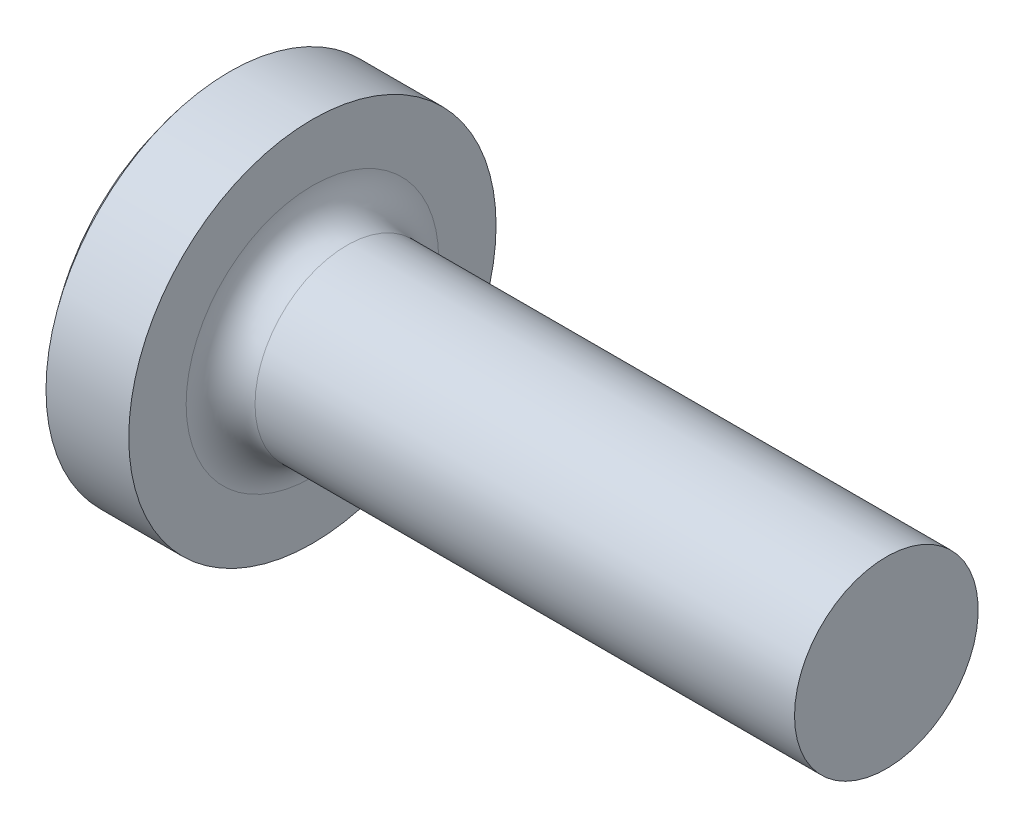
ISO-10303-21;
HEADER;
FILE_DESCRIPTION(('STEP AP214'),'2;1');
FILE_NAME('part.step','',(''),(''),'','','');
FILE_SCHEMA(('AUTOMOTIVE_DESIGN { 1 0 10303 214 1 1 1 1 }'));
ENDSEC;
DATA;
#1=APPLICATION_CONTEXT('core data for automotive mechanical design processes');
#2=APPLICATION_PROTOCOL_DEFINITION('international standard','automotive_design',2000,#1);
#3=PRODUCT_CONTEXT('',#1,'mechanical');
#4=PRODUCT('Part','Part','',(#3));
#5=PRODUCT_RELATED_PRODUCT_CATEGORY('part','',(#4));
#6=PRODUCT_DEFINITION_FORMATION('','',#4);
#7=PRODUCT_DEFINITION_CONTEXT('part definition',#1,'design');
#8=PRODUCT_DEFINITION('design','',#6,#7);
#9=PRODUCT_DEFINITION_SHAPE('','',#8);
#10=(LENGTH_UNIT() NAMED_UNIT(*) SI_UNIT(.MILLI.,.METRE.));
#11=(NAMED_UNIT(*) PLANE_ANGLE_UNIT() SI_UNIT($,.RADIAN.));
#12=(NAMED_UNIT(*) SI_UNIT($,.STERADIAN.) SOLID_ANGLE_UNIT());
#13=UNCERTAINTY_MEASURE_WITH_UNIT(LENGTH_MEASURE(1.E-05),#10,'distance_accuracy_value','');
#14=(GEOMETRIC_REPRESENTATION_CONTEXT(3) GLOBAL_UNCERTAINTY_ASSIGNED_CONTEXT((#13)) GLOBAL_UNIT_ASSIGNED_CONTEXT((#10,
#11,#12)) REPRESENTATION_CONTEXT('',''));
#15=CARTESIAN_POINT('',(0.,0.,0.));
#16=DIRECTION('',(0.,0.,1.));
#17=DIRECTION('',(1.,0.,0.));
#18=AXIS2_PLACEMENT_3D('',#15,#16,#17);
#19=CARTESIAN_POINT('',(0.9,-0.351276568235157,0.176));
#20=DIRECTION('',(1.,0.,0.));
#21=DIRECTION('',(0.,0.,-1.));
#22=AXIS2_PLACEMENT_3D('',#19,#20,#21);
#23=PLANE('',#22);
#24=DIRECTION('',(0.,0.,-1.));
#25=VECTOR('',#24,1.);
#26=CARTESIAN_POINT('',(0.9,0.175999999999998,0.351276568235158));
#27=LINE('',#26,#25);
#28=CARTESIAN_POINT('',(0.9,0.176000000000001,-0.351276568235157));
#29=VERTEX_POINT('',#28);
#30=CARTESIAN_POINT('',(0.900000000000567,0.176000000000056,-0.272346018814301));
#31=VERTEX_POINT('',#30);
#32=EDGE_CURVE('E313',#29,#31,#27,.F.);
#33=ORIENTED_EDGE('',*,*,#32,.F.);
#34=DIRECTION('',(0.,1.,0.));
#35=VECTOR('',#34,1.);
#36=CARTESIAN_POINT('',(0.899999999999999,0.176000000000001,-0.351276568235157));
#37=LINE('',#36,#35);
#38=CARTESIAN_POINT('',(0.9,-0.175999999999998,-0.351276568235158));
#39=VERTEX_POINT('',#38);
#40=EDGE_CURVE('E319',#39,#29,#37,.T.);
#41=ORIENTED_EDGE('',*,*,#40,.F.);
#42=DIRECTION('',(0.,0.,1.));
#43=VECTOR('',#42,1.);
#44=CARTESIAN_POINT('',(0.9,-0.175999999999999,-0.351276568235158));
#45=LINE('',#44,#43);
#46=CARTESIAN_POINT('',(0.900000000000567,-0.176000000000054,-0.272346018814302));
#47=VERTEX_POINT('',#46);
#48=EDGE_CURVE('E320',#47,#39,#45,.F.);
#49=ORIENTED_EDGE('',*,*,#48,.F.);
#50=CARTESIAN_POINT('',(0.899999999999679,0.,0.));
#51=DIRECTION('',(-1.,0.,0.));
#52=DIRECTION('',(0.,-1.,0.));
#53=AXIS2_PLACEMENT_3D('',#50,#51,#52);
#54=CIRCLE('',#53,0.32426586925105);
#55=EDGE_CURVE('E504',#47,#31,#54,.F.);
#56=ORIENTED_EDGE('',*,*,#55,.T.);
#57=EDGE_LOOP('',(#33,#41,#49,#56));
#58=FACE_BOUND('',#57,.T.);
#59=ADVANCED_FACE('F16',(#58),#23,.F.);
#60=CARTESIAN_POINT('',(0.9,-0.351276568235157,0.176));
#61=DIRECTION('',(1.,0.,0.));
#62=DIRECTION('',(0.,0.,-1.));
#63=AXIS2_PLACEMENT_3D('',#60,#61,#62);
#64=PLANE('',#63);
#65=DIRECTION('',(0.,1.,0.));
#66=VECTOR('',#65,1.);
#67=CARTESIAN_POINT('',(0.9,-0.351276568235157,0.176));
#68=LINE('',#67,#66);
#69=CARTESIAN_POINT('',(0.9,0.351276568235157,0.176));
#70=VERTEX_POINT('',#69);
#71=CARTESIAN_POINT('',(0.900000000000567,0.272346018814301,0.176000000000056));
#72=VERTEX_POINT('',#71);
#73=EDGE_CURVE('E146',#70,#72,#68,.F.);
#74=ORIENTED_EDGE('',*,*,#73,.F.);
#75=DIRECTION('',(0.,0.,1.));
#76=VECTOR('',#75,1.);
#77=CARTESIAN_POINT('',(0.9,0.351276568235157,0.176));
#78=LINE('',#77,#76);
#79=CARTESIAN_POINT('',(0.9,0.351276568235157,-0.176));
#80=VERTEX_POINT('',#79);
#81=EDGE_CURVE('E164',#80,#70,#78,.T.);
#82=ORIENTED_EDGE('',*,*,#81,.F.);
#83=DIRECTION('',(0.,1.,0.));
#84=VECTOR('',#83,1.);
#85=CARTESIAN_POINT('',(0.9,0.351276568235157,-0.176));
#86=LINE('',#85,#84);
#87=CARTESIAN_POINT('',(0.900000000000567,0.272346018814302,-0.176000000000055));
#88=VERTEX_POINT('',#87);
#89=EDGE_CURVE('E148',#88,#80,#86,.T.);
#90=ORIENTED_EDGE('',*,*,#89,.F.);
#91=CARTESIAN_POINT('',(0.899999999999679,0.,0.));
#92=DIRECTION('',(-1.,0.,0.));
#93=DIRECTION('',(0.,-1.,0.));
#94=AXIS2_PLACEMENT_3D('',#91,#92,#93);
#95=CIRCLE('',#94,0.32426586925105);
#96=EDGE_CURVE('E142',#88,#72,#95,.F.);
#97=ORIENTED_EDGE('',*,*,#96,.T.);
#98=EDGE_LOOP('',(#74,#82,#90,#97));
#99=FACE_BOUND('',#98,.T.);
#100=ADVANCED_FACE('F144',(#99),#64,.F.);
#101=CARTESIAN_POINT('',(0.9,-0.351276568235157,0.176));
#102=DIRECTION('',(1.,0.,0.));
#103=DIRECTION('',(0.,0.,-1.));
#104=AXIS2_PLACEMENT_3D('',#101,#102,#103);
#105=PLANE('',#104);
#106=DIRECTION('',(0.,0.,1.));
#107=VECTOR('',#106,1.);
#108=CARTESIAN_POINT('',(0.9,-0.175999999999999,-0.351276568235158));
#109=LINE('',#108,#107);
#110=CARTESIAN_POINT('',(0.9,-0.176000000000001,0.351276568235156));
#111=VERTEX_POINT('',#110);
#112=CARTESIAN_POINT('',(0.900000000000567,-0.176000000000056,0.272346018814301));
#113=VERTEX_POINT('',#112);
#114=EDGE_CURVE('E276',#111,#113,#109,.F.);
#115=ORIENTED_EDGE('',*,*,#114,.F.);
#116=DIRECTION('',(0.,1.,0.));
#117=VECTOR('',#116,1.);
#118=CARTESIAN_POINT('',(0.9,-0.176000000000001,0.351276568235157));
#119=LINE('',#118,#117);
#120=CARTESIAN_POINT('',(0.9,0.175999999999998,0.351276568235158));
#121=VERTEX_POINT('',#120);
#122=EDGE_CURVE('E282',#121,#111,#119,.F.);
#123=ORIENTED_EDGE('',*,*,#122,.F.);
#124=DIRECTION('',(0.,0.,-1.));
#125=VECTOR('',#124,1.);
#126=CARTESIAN_POINT('',(0.9,0.175999999999998,0.351276568235158));
#127=LINE('',#126,#125);
#128=CARTESIAN_POINT('',(0.900000000000567,0.176000000000031,0.272346018814317));
#129=VERTEX_POINT('',#128);
#130=EDGE_CURVE('E283',#129,#121,#127,.F.);
#131=ORIENTED_EDGE('',*,*,#130,.F.);
#132=CARTESIAN_POINT('',(0.899999999999679,0.,0.));
#133=DIRECTION('',(-1.,0.,0.));
#134=DIRECTION('',(0.,-1.,0.));
#135=AXIS2_PLACEMENT_3D('',#132,#133,#134);
#136=CIRCLE('',#135,0.32426586925105);
#137=EDGE_CURVE('E154',#129,#113,#136,.F.);
#138=ORIENTED_EDGE('',*,*,#137,.T.);
#139=EDGE_LOOP('',(#115,#123,#131,#138));
#140=FACE_BOUND('',#139,.T.);
#141=ADVANCED_FACE('F710',(#140),#105,.F.);
#142=CARTESIAN_POINT('',(0.899999999999679,0.,0.));
#143=DIRECTION('',(-1.,0.,0.));
#144=DIRECTION('',(0.,-1.,0.));
#145=AXIS2_PLACEMENT_3D('',#142,#143,#144);
#146=CONICAL_SURFACE('',#145,0.32426586925105,1.25663706143554);
#147=CARTESIAN_POINT('',(1.00536036773552,0.,0.));
#148=VERTEX_POINT('',#147);
#149=VERTEX_LOOP('',#148);
#150=FACE_BOUND('',#149,.T.);
#151=CARTESIAN_POINT('',(0.900000000001455,0.,0.));
#152=DIRECTION('',(-1.,0.,0.));
#153=DIRECTION('',(0.,0.,1.));
#154=AXIS2_PLACEMENT_3D('',#151,#152,#153);
#155=CIRCLE('',#154,0.324265869259932);
#156=EDGE_CURVE('E312',#88,#31,#155,.T.);
#157=ORIENTED_EDGE('',*,*,#156,.T.);
#158=ORIENTED_EDGE('',*,*,#55,.F.);
#159=CARTESIAN_POINT('',(0.900000000001455,0.,0.));
#160=DIRECTION('',(-1.,0.,0.));
#161=DIRECTION('',(0.,0.,1.));
#162=AXIS2_PLACEMENT_3D('',#159,#160,#161);
#163=CIRCLE('',#162,0.324265869259932);
#164=CARTESIAN_POINT('',(0.900000000000567,-0.272346018814301,-0.176000000000055));
#165=VERTEX_POINT('',#164);
#166=EDGE_CURVE('E373',#47,#165,#163,.T.);
#167=ORIENTED_EDGE('',*,*,#166,.T.);
#168=CARTESIAN_POINT('',(0.899999999999679,0.,0.));
#169=DIRECTION('',(-1.,0.,0.));
#170=DIRECTION('',(0.,-1.,0.));
#171=AXIS2_PLACEMENT_3D('',#168,#169,#170);
#172=CIRCLE('',#171,0.32426586925105);
#173=CARTESIAN_POINT('',(0.900000000000567,-0.272346018814301,0.176000000000056));
#174=VERTEX_POINT('',#173);
#175=EDGE_CURVE('E327',#165,#174,#172,.T.);
#176=ORIENTED_EDGE('',*,*,#175,.T.);
#177=CARTESIAN_POINT('',(0.900000000001455,0.,0.));
#178=DIRECTION('',(-1.,0.,0.));
#179=DIRECTION('',(0.,0.,1.));
#180=AXIS2_PLACEMENT_3D('',#177,#178,#179);
#181=CIRCLE('',#180,0.324265869259932);
#182=EDGE_CURVE('E275',#174,#113,#181,.T.);
#183=ORIENTED_EDGE('',*,*,#182,.T.);
#184=ORIENTED_EDGE('',*,*,#137,.F.);
#185=CARTESIAN_POINT('',(0.900000000001455,0.,0.));
#186=DIRECTION('',(-1.,0.,0.));
#187=DIRECTION('',(0.,0.,1.));
#188=AXIS2_PLACEMENT_3D('',#185,#186,#187);
#189=CIRCLE('',#188,0.324265869259932);
#190=EDGE_CURVE('E167',#129,#72,#189,.T.);
#191=ORIENTED_EDGE('',*,*,#190,.T.);
#192=ORIENTED_EDGE('',*,*,#96,.F.);
#193=EDGE_LOOP('',(#157,#158,#167,#176,#183,#184,#191,#192));
#194=FACE_BOUND('',#193,.T.);
#195=ADVANCED_FACE('F168',(#150,#194),#146,.F.);
#196=CARTESIAN_POINT('',(0.9,-0.351276568235157,0.176));
#197=DIRECTION('',(1.,0.,0.));
#198=DIRECTION('',(0.,0.,-1.));
#199=AXIS2_PLACEMENT_3D('',#196,#197,#198);
#200=PLANE('',#199);
#201=DIRECTION('',(0.,1.,0.));
#202=VECTOR('',#201,1.);
#203=CARTESIAN_POINT('',(0.9,0.351276568235157,-0.176));
#204=LINE('',#203,#202);
#205=CARTESIAN_POINT('',(0.9,-0.351276568235158,-0.176));
#206=VERTEX_POINT('',#205);
#207=EDGE_CURVE('E323',#206,#165,#204,.T.);
#208=ORIENTED_EDGE('',*,*,#207,.F.);
#209=DIRECTION('',(0.,0.,1.));
#210=VECTOR('',#209,1.);
#211=CARTESIAN_POINT('',(0.9,-0.351276568235158,-0.176));
#212=LINE('',#211,#210);
#213=CARTESIAN_POINT('',(0.9,-0.351276568235158,0.176));
#214=VERTEX_POINT('',#213);
#215=EDGE_CURVE('E263',#214,#206,#212,.F.);
#216=ORIENTED_EDGE('',*,*,#215,.F.);
#217=DIRECTION('',(0.,1.,0.));
#218=VECTOR('',#217,1.);
#219=CARTESIAN_POINT('',(0.9,-0.351276568235157,0.176));
#220=LINE('',#219,#218);
#221=EDGE_CURVE('E269',#174,#214,#220,.F.);
#222=ORIENTED_EDGE('',*,*,#221,.F.);
#223=ORIENTED_EDGE('',*,*,#175,.F.);
#224=EDGE_LOOP('',(#208,#216,#222,#223));
#225=FACE_BOUND('',#224,.T.);
#226=ADVANCED_FACE('F695',(#225),#200,.F.);
#227=CARTESIAN_POINT('',(0.9,0.351276568235157,-0.176));
#228=DIRECTION('',(0.,0.,1.));
#229=DIRECTION('',(1.,0.,0.));
#230=AXIS2_PLACEMENT_3D('',#227,#228,#229);
#231=PLANE('',#230);
#232=CARTESIAN_POINT('',(0.118768628304798,-0.740784148355366,-0.176));
#233=CARTESIAN_POINT('',(0.0985079804228012,-0.675625375165541,-0.176000000000001));
#234=CARTESIAN_POINT('',(0.0809669832444764,-0.609859297006919,-0.176000000000002));
#235=CARTESIAN_POINT('',(0.051324290295171,-0.47711253075208,-0.175999999999999));
#236=CARTESIAN_POINT('',(0.0392225945241903,-0.410131842655864,-0.175999999999996));
#237=CARTESIAN_POINT('',(0.0298405494568816,-0.342543849590851,-0.175999999999992));
#238=B_SPLINE_CURVE_WITH_KNOTS('',3,(#232,#233,#234,#235,#236,#237),.UNSPECIFIED.,.F.,.F.,(4,2,
4),(0.,0.20419542738608,0.40839085477216),.UNSPECIFIED.);
#239=CARTESIAN_POINT('',(0.118768628304983,-0.740784148355962,-0.176));
#240=VERTEX_POINT('',#239);
#241=CARTESIAN_POINT('',(0.0298405494691908,-0.342543849594728,-0.176));
#242=VERTEX_POINT('',#241);
#243=EDGE_CURVE('E244',#240,#242,#238,.T.);
#244=ORIENTED_EDGE('',*,*,#243,.F.);
#245=DIRECTION('',(-0.89493436774996,-0.446197800778958,0.));
#246=VECTOR('',#245,1.);
#247=CARTESIAN_POINT('',(0.9,-0.351276568235157,-0.176));
#248=LINE('',#247,#246);
#249=EDGE_CURVE('E245',#206,#240,#248,.T.);
#250=ORIENTED_EDGE('',*,*,#249,.F.);
#251=ORIENTED_EDGE('',*,*,#207,.T.);
#252=CARTESIAN_POINT('',(0.90000000000064,-0.272346018812238,-0.176));
#253=CARTESIAN_POINT('',(0.799307331680196,-0.280725979726032,-0.176));
#254=CARTESIAN_POINT('',(0.698605885550756,-0.288999402443913,-0.176));
#255=CARTESIAN_POINT('',(0.497188868387912,-0.305370527903754,-0.176));
#256=CARTESIAN_POINT('',(0.396473297378266,-0.313468230937793,-0.176));
#257=CARTESIAN_POINT('',(0.207118890751843,-0.328561778478797,-0.176));
#258=CARTESIAN_POINT('',(0.118481299322804,-0.335573228772296,-0.176));
#259=CARTESIAN_POINT('',(0.0298405494651892,-0.342543849595043,-0.176));
#260=B_SPLINE_CURVE_WITH_KNOTS('',3,(#252,#253,#254,#255,#256,#257,#258,#259),.UNSPECIFIED.,.F.,
.F.,(4,2,2,4),(0.,0.3031221189748,0.606243734063046,0.872987041262529),.UNSPECIFIED.);
#261=EDGE_CURVE('E326',#165,#242,#260,.T.);
#262=ORIENTED_EDGE('',*,*,#261,.T.);
#263=EDGE_LOOP('',(#244,#250,#251,#262));
#264=FACE_BOUND('',#263,.T.);
#265=ADVANCED_FACE('F489',(#264),#231,.T.);
#266=CARTESIAN_POINT('',(0.0298405495868792,0.,0.));
#267=DIRECTION('',(-1.,0.,0.));
#268=DIRECTION('',(0.,-1.,0.));
#269=AXIS2_PLACEMENT_3D('',#266,#267,#268);
#270=CONICAL_SURFACE('',#269,0.385113345508614,0.0698131700854167);
#271=CARTESIAN_POINT('',(0.0298405494597493,-0.175999999999999,-0.342543849595471));
#272=CARTESIAN_POINT('',(0.149471630685286,-0.175999999999999,-0.333133981029725));
#273=CARTESIAN_POINT('',(0.26909723671606,-0.175999999999999,-0.323652452178245));
#274=CARTESIAN_POINT('',(0.508331266262809,-0.175999999999999,-0.30447901835338));
#275=CARTESIAN_POINT('',(0.62793968982115,-0.175999999999999,-0.294787113907975));
#276=CARTESIAN_POINT('',(0.79835994002419,-0.175999999999999,-0.280778898784705));
#277=CARTESIAN_POINT('',(0.84918111379679,-0.175999999999999,-0.276576272888556));
#278=CARTESIAN_POINT('',(0.900000000000368,-0.175999999999999,-0.272346018812261));
#279=B_SPLINE_CURVE_WITH_KNOTS('',3,(#271,#272,#273,#274,#275,#276,#277,#278),.UNSPECIFIED.,.F.,
.F.,(4,2,2,4),(0.,0.360002007510788,0.72000311163038,0.872987030446483),.UNSPECIFIED.);
#280=CARTESIAN_POINT('',(0.0298405494664708,-0.175999999999999,-0.342543849623459));
#281=VERTEX_POINT('',#280);
#282=EDGE_CURVE('E370',#281,#47,#279,.T.);
#283=ORIENTED_EDGE('',*,*,#282,.F.);
#284=CARTESIAN_POINT('',(0.0298405494731924,0.,0.));
#285=DIRECTION('',(-1.,0.,0.));
#286=DIRECTION('',(0.,-1.,0.));
#287=AXIS2_PLACEMENT_3D('',#284,#285,#286);
#288=CIRCLE('',#287,0.385113345516564);
#289=EDGE_CURVE('E482',#242,#281,#288,.F.);
#290=ORIENTED_EDGE('',*,*,#289,.F.);
#291=ORIENTED_EDGE('',*,*,#261,.F.);
#292=ORIENTED_EDGE('',*,*,#166,.F.);
#293=EDGE_LOOP('',(#283,#290,#291,#292));
#294=FACE_BOUND('',#293,.T.);
#295=ADVANCED_FACE('F493',(#294),#270,.F.);
#296=CARTESIAN_POINT('',(0.9,-0.175999999999999,-0.351276568235158));
#297=DIRECTION('',(0.,1.,0.));
#298=DIRECTION('',(0.,0.,1.));
#299=AXIS2_PLACEMENT_3D('',#296,#297,#298);
#300=PLANE('',#299);
#301=ORIENTED_EDGE('',*,*,#48,.T.);
#302=DIRECTION('',(0.89493436774996,0.,0.446197800778958));
#303=VECTOR('',#302,1.);
#304=CARTESIAN_POINT('',(0.900000000000001,-0.175999999999997,-0.351276568235158));
#305=LINE('',#304,#303);
#306=CARTESIAN_POINT('',(0.118768628305169,-0.175999999999998,-0.740784148356559));
#307=VERTEX_POINT('',#306);
#308=EDGE_CURVE('E316',#307,#39,#305,.T.);
#309=ORIENTED_EDGE('',*,*,#308,.F.);
#310=CARTESIAN_POINT('',(2.5,-0.175999999999999,0.));
#311=DIRECTION('',(0.,1.,0.));
#312=DIRECTION('',(0.,0.,1.));
#313=AXIS2_PLACEMENT_3D('',#310,#311,#312);
#314=CIRCLE('',#313,2.49379710481827);
#315=EDGE_CURVE('E480',#281,#307,#314,.F.);
#316=ORIENTED_EDGE('',*,*,#315,.F.);
#317=ORIENTED_EDGE('',*,*,#282,.T.);
#318=EDGE_LOOP('',(#301,#309,#316,#317));
#319=FACE_BOUND('',#318,.T.);
#320=ADVANCED_FACE('F468',(#319),#300,.T.);
#321=CARTESIAN_POINT('',(0.9,0.176000000000001,-0.351276568235157));
#322=DIRECTION('',(-0.446197800778958,0.,0.89493436774996));
#323=DIRECTION('',(0.89493436774996,0.,0.446197800778958));
#324=AXIS2_PLACEMENT_3D('',#321,#322,#323);
#325=PLANE('',#324);
#326=ORIENTED_EDGE('',*,*,#40,.T.);
#327=DIRECTION('',(0.89493436774996,0.,0.446197800778958));
#328=VECTOR('',#327,1.);
#329=CARTESIAN_POINT('',(0.118768628305168,0.176000000000003,-0.740784148356558));
#330=LINE('',#329,#328);
#331=CARTESIAN_POINT('',(0.118768628305169,0.176000000000005,-0.740784148356557));
#332=VERTEX_POINT('',#331);
#333=EDGE_CURVE('E309',#332,#29,#330,.T.);
#334=ORIENTED_EDGE('',*,*,#333,.F.);
#335=CARTESIAN_POINT('',(0.118768628305168,-0.175999999999998,-0.740784148356559));
#336=CARTESIAN_POINT('',(0.1150195287229,-0.117333333333333,-0.742653380390536));
#337=CARTESIAN_POINT('',(0.113144978931766,-0.0586666666666675,-0.743587996407527));
#338=CARTESIAN_POINT('',(0.113144978931768,0.0586666666666627,-0.743587996407534));
#339=CARTESIAN_POINT('',(0.115019528722904,0.117333333333328,-0.742653380390551));
#340=CARTESIAN_POINT('',(0.118768628305175,0.175999999999993,-0.740784148356581));
#341=B_SPLINE_CURVE_WITH_KNOTS('',3,(#335,#336,#337,#338,#339,#340),.UNSPECIFIED.,.F.,.F.,(4,2,
4),(0.,0.176112143238807,0.352224286477615),.UNSPECIFIED.);
#342=EDGE_CURVE('E472',#307,#332,#341,.T.);
#343=ORIENTED_EDGE('',*,*,#342,.F.);
#344=ORIENTED_EDGE('',*,*,#308,.T.);
#345=EDGE_LOOP('',(#326,#334,#343,#344));
#346=FACE_BOUND('',#345,.T.);
#347=ADVANCED_FACE('F465',(#346),#325,.T.);
#348=CARTESIAN_POINT('',(0.9,0.175999999999998,0.351276568235158));
#349=DIRECTION('',(0.,-1.,0.));
#350=DIRECTION('',(0.,0.,-1.));
#351=AXIS2_PLACEMENT_3D('',#348,#349,#350);
#352=PLANE('',#351);
#353=CARTESIAN_POINT('',(2.5,0.176000000000003,0.));
#354=DIRECTION('',(0.,1.,0.));
#355=DIRECTION('',(0.,0.,1.));
#356=AXIS2_PLACEMENT_3D('',#353,#354,#355);
#357=CIRCLE('',#356,2.49379710481827);
#358=CARTESIAN_POINT('',(0.0298405494691929,0.176000000000002,-0.34254384962324));
#359=VERTEX_POINT('',#358);
#360=EDGE_CURVE('E479',#332,#359,#357,.T.);
#361=ORIENTED_EDGE('',*,*,#360,.F.);
#362=ORIENTED_EDGE('',*,*,#333,.T.);
#363=ORIENTED_EDGE('',*,*,#32,.T.);
#364=CARTESIAN_POINT('',(0.900000000000587,0.176000000000001,-0.272346018812242));
#365=CARTESIAN_POINT('',(0.799307331680142,0.176000000000001,-0.280725979726035));
#366=CARTESIAN_POINT('',(0.698605885550701,0.176000000000001,-0.288999402443917));
#367=CARTESIAN_POINT('',(0.497188868387855,0.176000000000001,-0.305370527903758));
#368=CARTESIAN_POINT('',(0.396473297378208,0.176000000000001,-0.313468230937797));
#369=CARTESIAN_POINT('',(0.207118890751805,0.176000000000001,-0.328561778478799));
#370=CARTESIAN_POINT('',(0.118481299322787,0.176000000000001,-0.335573228772297));
#371=CARTESIAN_POINT('',(0.0298405494651934,0.176000000000001,-0.342543849595042));
#372=B_SPLINE_CURVE_WITH_KNOTS('',3,(#364,#365,#366,#367,#368,#369,#370,#371),.UNSPECIFIED.,.F.,
.F.,(4,2,2,4),(0.,0.303122118974803,0.606243734063053,0.872987041262472),.UNSPECIFIED.);
#373=EDGE_CURVE('E360',#31,#359,#372,.T.);
#374=ORIENTED_EDGE('',*,*,#373,.T.);
#375=EDGE_LOOP('',(#361,#362,#363,#374));
#376=FACE_BOUND('',#375,.T.);
#377=ADVANCED_FACE('F461',(#376),#352,.T.);
#378=CARTESIAN_POINT('',(0.0298405495868792,0.,0.));
#379=DIRECTION('',(-1.,0.,0.));
#380=DIRECTION('',(0.,-1.,0.));
#381=AXIS2_PLACEMENT_3D('',#378,#379,#380);
#382=CONICAL_SURFACE('',#381,0.385113345508614,0.0698131700854167);
#383=ORIENTED_EDGE('',*,*,#373,.F.);
#384=ORIENTED_EDGE('',*,*,#156,.F.);
#385=CARTESIAN_POINT('',(0.0298405494597394,0.342543849595471,-0.176));
#386=CARTESIAN_POINT('',(0.149471630685276,0.333133981029726,-0.176));
#387=CARTESIAN_POINT('',(0.26909723671605,0.323652452178245,-0.176));
#388=CARTESIAN_POINT('',(0.5083312662628,0.304479018353381,-0.176));
#389=CARTESIAN_POINT('',(0.627939689821141,0.294787113907976,-0.176));
#390=CARTESIAN_POINT('',(0.798359940024185,0.280778898784705,-0.176));
#391=CARTESIAN_POINT('',(0.849181113796787,0.276576272888556,-0.176));
#392=CARTESIAN_POINT('',(0.900000000000368,0.272346018812261,-0.176));
#393=B_SPLINE_CURVE_WITH_KNOTS('',3,(#385,#386,#387,#388,#389,#390,#391,#392),.UNSPECIFIED.,.F.,
.F.,(4,2,2,4),(0.,0.360002007510788,0.720003111630381,0.872987030446493),.UNSPECIFIED.);
#394=CARTESIAN_POINT('',(0.0298405494582099,0.342543849592437,-0.176));
#395=VERTEX_POINT('',#394);
#396=EDGE_CURVE('E192',#395,#88,#393,.T.);
#397=ORIENTED_EDGE('',*,*,#396,.F.);
#398=CARTESIAN_POINT('',(0.0298405494731924,0.,0.));
#399=DIRECTION('',(-1.,0.,0.));
#400=DIRECTION('',(0.,-1.,0.));
#401=AXIS2_PLACEMENT_3D('',#398,#399,#400);
#402=CIRCLE('',#401,0.385113345516564);
#403=EDGE_CURVE('E501',#359,#395,#402,.F.);
#404=ORIENTED_EDGE('',*,*,#403,.F.);
#405=EDGE_LOOP('',(#383,#384,#397,#404));
#406=FACE_BOUND('',#405,.T.);
#407=ADVANCED_FACE('F459',(#406),#382,.F.);
#408=CARTESIAN_POINT('',(0.9,0.351276568235157,-0.176));
#409=DIRECTION('',(0.,0.,1.));
#410=DIRECTION('',(1.,0.,0.));
#411=AXIS2_PLACEMENT_3D('',#408,#409,#410);
#412=PLANE('',#411);
#413=ORIENTED_EDGE('',*,*,#89,.T.);
#414=DIRECTION('',(0.89493436774996,-0.446197800778958,0.));
#415=VECTOR('',#414,1.);
#416=CARTESIAN_POINT('',(0.9,0.351276568235157,-0.176));
#417=LINE('',#416,#415);
#418=CARTESIAN_POINT('',(0.118768628305169,0.740784148356558,-0.176));
#419=VERTEX_POINT('',#418);
#420=EDGE_CURVE('E299',#419,#80,#417,.T.);
#421=ORIENTED_EDGE('',*,*,#420,.F.);
#422=CARTESIAN_POINT('',(0.0298405494566804,0.342543849589403,-0.175999999999999));
#423=CARTESIAN_POINT('',(0.0392225945182286,0.410131842613332,-0.176));
#424=CARTESIAN_POINT('',(0.0513242902801888,0.477112530669334,-0.176));
#425=CARTESIAN_POINT('',(0.0809669832049328,0.609859296845487,-0.176));
#426=CARTESIAN_POINT('',(0.0985079803677168,0.675625374965638,-0.175999999999999));
#427=CARTESIAN_POINT('',(0.118768628230913,0.740784148117863,-0.175999999999999));
#428=B_SPLINE_CURVE_WITH_KNOTS('',3,(#422,#423,#424,#425,#426,#427),.UNSPECIFIED.,.F.,.F.,(4,2,
4),(0.,0.204195427262549,0.408390854525099),.UNSPECIFIED.);
#429=EDGE_CURVE('E216',#395,#419,#428,.T.);
#430=ORIENTED_EDGE('',*,*,#429,.F.);
#431=ORIENTED_EDGE('',*,*,#396,.T.);
#432=EDGE_LOOP('',(#413,#421,#430,#431));
#433=FACE_BOUND('',#432,.T.);
#434=ADVANCED_FACE('F441',(#433),#412,.T.);
#435=CARTESIAN_POINT('',(0.9,0.351276568235157,0.176));
#436=DIRECTION('',(-0.446197800778958,-0.89493436774996,0.));
#437=DIRECTION('',(0.89493436774996,-0.446197800778958,0.));
#438=AXIS2_PLACEMENT_3D('',#435,#436,#437);
#439=PLANE('',#438);
#440=ORIENTED_EDGE('',*,*,#81,.T.);
#441=DIRECTION('',(0.89493436774996,-0.446197800778958,0.));
#442=VECTOR('',#441,1.);
#443=CARTESIAN_POINT('',(0.118768628305168,0.740784148356558,0.176));
#444=LINE('',#443,#442);
#445=CARTESIAN_POINT('',(0.118768628304983,0.740784148355961,0.176));
#446=VERTEX_POINT('',#445);
#447=EDGE_CURVE('E163',#446,#70,#444,.T.);
#448=ORIENTED_EDGE('',*,*,#447,.F.);
#449=CARTESIAN_POINT('',(0.118768628305168,0.740784148356558,0.176));
#450=CARTESIAN_POINT('',(0.113144978931767,0.74358799640753,0.0881121789663998));
#451=CARTESIAN_POINT('',(0.113144978931767,0.74358799640753,0.));
#452=B_SPLINE_CURVE_WITH_KNOTS('',2,(#449,#450,#451),.UNSPECIFIED.,.F.,.F.,(3,3),(0.,1.),.UNSPECIFIED.);
#453=CARTESIAN_POINT('',(0.113144978931767,0.74358799640753,0.));
#454=VERTEX_POINT('',#453);
#455=EDGE_CURVE('E214',#454,#446,#452,.F.);
#456=ORIENTED_EDGE('',*,*,#455,.F.);
#457=CARTESIAN_POINT('',(0.113144978931767,0.74358799640753,0.));
#458=CARTESIAN_POINT('',(0.113144978931767,0.74358799640753,-0.0881121789663981));
#459=CARTESIAN_POINT('',(0.118768628305169,0.740784148356558,-0.176));
#460=B_SPLINE_CURVE_WITH_KNOTS('',2,(#457,#458,#459),.UNSPECIFIED.,.F.,.F.,(3,3),(0.,1.),.UNSPECIFIED.);
#461=EDGE_CURVE('E291',#419,#454,#460,.F.);
#462=ORIENTED_EDGE('',*,*,#461,.F.);
#463=ORIENTED_EDGE('',*,*,#420,.T.);
#464=EDGE_LOOP('',(#440,#448,#456,#462,#463));
#465=FACE_BOUND('',#464,.T.);
#466=ADVANCED_FACE('F203',(#465),#439,.T.);
#467=CARTESIAN_POINT('',(0.9,-0.351276568235157,0.176));
#468=DIRECTION('',(0.,0.,-1.));
#469=DIRECTION('',(-1.,0.,0.));
#470=AXIS2_PLACEMENT_3D('',#467,#468,#469);
#471=PLANE('',#470);
#472=CARTESIAN_POINT('',(0.118768628304798,0.740784148355365,0.176));
#473=CARTESIAN_POINT('',(0.0985079804228011,0.67562537516554,0.176000000000002));
#474=CARTESIAN_POINT('',(0.0809669832444762,0.609859297006918,0.176000000000001));
#475=CARTESIAN_POINT('',(0.0513242902951705,0.477112530752079,0.175999999999998));
#476=CARTESIAN_POINT('',(0.0392225945241896,0.410131842655863,0.175999999999995));
#477=CARTESIAN_POINT('',(0.0298405494568808,0.342543849590849,0.175999999999991));
#478=B_SPLINE_CURVE_WITH_KNOTS('',3,(#472,#473,#474,#475,#476,#477),.UNSPECIFIED.,.F.,.F.,(4,2,
4),(0.,0.20419542738608,0.408390854772161),.UNSPECIFIED.);
#479=CARTESIAN_POINT('',(0.0298405494691907,0.342543849594729,0.176));
#480=VERTEX_POINT('',#479);
#481=EDGE_CURVE('E207',#446,#480,#478,.T.);
#482=ORIENTED_EDGE('',*,*,#481,.F.);
#483=ORIENTED_EDGE('',*,*,#447,.T.);
#484=ORIENTED_EDGE('',*,*,#73,.T.);
#485=CARTESIAN_POINT('',(0.90000000000064,0.272346018812238,0.176));
#486=CARTESIAN_POINT('',(0.799307331680196,0.280725979726031,0.176));
#487=CARTESIAN_POINT('',(0.698605885550756,0.288999402443913,0.176));
#488=CARTESIAN_POINT('',(0.497188868387912,0.305370527903754,0.176));
#489=CARTESIAN_POINT('',(0.396473297378266,0.313468230937793,0.176));
#490=CARTESIAN_POINT('',(0.207118890751843,0.328561778478797,0.176));
#491=CARTESIAN_POINT('',(0.118481299322804,0.335573228772297,0.176));
#492=CARTESIAN_POINT('',(0.029840549465189,0.342543849595043,0.176));
#493=B_SPLINE_CURVE_WITH_KNOTS('',3,(#485,#486,#487,#488,#489,#490,#491,#492),.UNSPECIFIED.,.F.,
.F.,(4,2,2,4),(0.,0.3031221189748,0.606243734063046,0.872987041262529),.UNSPECIFIED.);
#494=EDGE_CURVE('E161',#72,#480,#493,.T.);
#495=ORIENTED_EDGE('',*,*,#494,.T.);
#496=EDGE_LOOP('',(#482,#483,#484,#495));
#497=FACE_BOUND('',#496,.T.);
#498=ADVANCED_FACE('F159',(#497),#471,.T.);
#499=CARTESIAN_POINT('',(0.0298405495868792,0.,0.));
#500=DIRECTION('',(-1.,0.,0.));
#501=DIRECTION('',(0.,-1.,0.));
#502=AXIS2_PLACEMENT_3D('',#499,#500,#501);
#503=CONICAL_SURFACE('',#502,0.385113345508614,0.0698131700854167);
#504=CARTESIAN_POINT('',(0.0298405494597491,0.175999999999999,0.342543849595471));
#505=CARTESIAN_POINT('',(0.149471630685285,0.175999999999999,0.333133981029725));
#506=CARTESIAN_POINT('',(0.269097236716059,0.175999999999999,0.323652452178245));
#507=CARTESIAN_POINT('',(0.508331266262809,0.175999999999999,0.304479018353381));
#508=CARTESIAN_POINT('',(0.62793968982115,0.175999999999999,0.294787113907976));
#509=CARTESIAN_POINT('',(0.798359940024188,0.175999999999999,0.280778898784705));
#510=CARTESIAN_POINT('',(0.849181113796785,0.175999999999999,0.276576272888556));
#511=CARTESIAN_POINT('',(0.900000000000362,0.175999999999999,0.272346018812262));
#512=B_SPLINE_CURVE_WITH_KNOTS('',3,(#504,#505,#506,#507,#508,#509,#510,#511),.UNSPECIFIED.,.F.,
.F.,(4,2,2,4),(0.,0.360002007510788,0.72000311163038,0.872987030446477),.UNSPECIFIED.);
#513=CARTESIAN_POINT('',(0.0298405494664707,0.175999999999999,0.342543849623459));
#514=VERTEX_POINT('',#513);
#515=EDGE_CURVE('E172',#514,#129,#512,.T.);
#516=ORIENTED_EDGE('',*,*,#515,.F.);
#517=CARTESIAN_POINT('',(0.0298405494731924,0.,0.));
#518=DIRECTION('',(-1.,0.,0.));
#519=DIRECTION('',(0.,-1.,0.));
#520=AXIS2_PLACEMENT_3D('',#517,#518,#519);
#521=CIRCLE('',#520,0.385113345516564);
#522=EDGE_CURVE('E176',#480,#514,#521,.F.);
#523=ORIENTED_EDGE('',*,*,#522,.F.);
#524=ORIENTED_EDGE('',*,*,#494,.F.);
#525=ORIENTED_EDGE('',*,*,#190,.F.);
#526=EDGE_LOOP('',(#516,#523,#524,#525));
#527=FACE_BOUND('',#526,.T.);
#528=ADVANCED_FACE('F174',(#527),#503,.F.);
#529=CARTESIAN_POINT('',(0.9,0.175999999999998,0.351276568235158));
#530=DIRECTION('',(0.,-1.,0.));
#531=DIRECTION('',(0.,0.,-1.));
#532=AXIS2_PLACEMENT_3D('',#529,#530,#531);
#533=PLANE('',#532);
#534=ORIENTED_EDGE('',*,*,#130,.T.);
#535=DIRECTION('',(-0.89493436774996,0.,0.446197800778958));
#536=VECTOR('',#535,1.);
#537=CARTESIAN_POINT('',(0.900000000000001,0.175999999999997,0.351276568235157));
#538=LINE('',#537,#536);
#539=CARTESIAN_POINT('',(0.118768628305168,0.175999999999998,0.740784148356559));
#540=VERTEX_POINT('',#539);
#541=EDGE_CURVE('E279',#540,#121,#538,.F.);
#542=ORIENTED_EDGE('',*,*,#541,.F.);
#543=CARTESIAN_POINT('',(2.5,0.175999999999999,0.));
#544=DIRECTION('',(0.,1.,0.));
#545=DIRECTION('',(0.,0.,1.));
#546=AXIS2_PLACEMENT_3D('',#543,#544,#545);
#547=CIRCLE('',#546,2.49379710481827);
#548=EDGE_CURVE('E431',#514,#540,#547,.T.);
#549=ORIENTED_EDGE('',*,*,#548,.F.);
#550=ORIENTED_EDGE('',*,*,#515,.T.);
#551=EDGE_LOOP('',(#534,#542,#549,#550));
#552=FACE_BOUND('',#551,.T.);
#553=ADVANCED_FACE('F422',(#552),#533,.T.);
#554=CARTESIAN_POINT('',(0.9,-0.176000000000001,0.351276568235157));
#555=DIRECTION('',(-0.446197800778958,0.,-0.89493436774996));
#556=DIRECTION('',(-0.89493436774996,0.,0.446197800778958));
#557=AXIS2_PLACEMENT_3D('',#554,#555,#556);
#558=PLANE('',#557);
#559=ORIENTED_EDGE('',*,*,#122,.T.);
#560=DIRECTION('',(0.89493436774996,0.,-0.446197800778958));
#561=VECTOR('',#560,1.);
#562=CARTESIAN_POINT('',(0.118768628305168,-0.176000000000002,0.740784148356557));
#563=LINE('',#562,#561);
#564=CARTESIAN_POINT('',(0.118768628305169,-0.176000000000004,0.740784148356557));
#565=VERTEX_POINT('',#564);
#566=EDGE_CURVE('E272',#565,#111,#563,.T.);
#567=ORIENTED_EDGE('',*,*,#566,.F.);
#568=CARTESIAN_POINT('',(0.118768628305168,0.175999999999998,0.740784148356558));
#569=CARTESIAN_POINT('',(0.115019528722899,0.117333333333333,0.742653380390536));
#570=CARTESIAN_POINT('',(0.113144978931766,0.0586666666666676,0.743587996407526));
#571=CARTESIAN_POINT('',(0.113144978931768,-0.0586666666666627,0.743587996407534));
#572=CARTESIAN_POINT('',(0.115019528722904,-0.117333333333328,0.742653380390551));
#573=CARTESIAN_POINT('',(0.118768628305175,-0.175999999999993,0.740784148356581));
#574=B_SPLINE_CURVE_WITH_KNOTS('',3,(#568,#569,#570,#571,#572,#573),.UNSPECIFIED.,.F.,.F.,(4,2,
4),(0.,0.176112143238808,0.352224286477615),.UNSPECIFIED.);
#575=EDGE_CURVE('E425',#540,#565,#574,.T.);
#576=ORIENTED_EDGE('',*,*,#575,.F.);
#577=ORIENTED_EDGE('',*,*,#541,.T.);
#578=EDGE_LOOP('',(#559,#567,#576,#577));
#579=FACE_BOUND('',#578,.T.);
#580=ADVANCED_FACE('F418',(#579),#558,.T.);
#581=CARTESIAN_POINT('',(0.9,-0.175999999999999,-0.351276568235158));
#582=DIRECTION('',(0.,1.,0.));
#583=DIRECTION('',(0.,0.,1.));
#584=AXIS2_PLACEMENT_3D('',#581,#582,#583);
#585=PLANE('',#584);
#586=CARTESIAN_POINT('',(2.5,-0.176000000000003,0.));
#587=DIRECTION('',(0.,1.,0.));
#588=DIRECTION('',(0.,0.,1.));
#589=AXIS2_PLACEMENT_3D('',#586,#587,#588);
#590=CIRCLE('',#589,2.49379710481827);
#591=CARTESIAN_POINT('',(0.0298405494691929,-0.176000000000002,0.34254384962324));
#592=VERTEX_POINT('',#591);
#593=EDGE_CURVE('E430',#565,#592,#590,.F.);
#594=ORIENTED_EDGE('',*,*,#593,.F.);
#595=ORIENTED_EDGE('',*,*,#566,.T.);
#596=ORIENTED_EDGE('',*,*,#114,.T.);
#597=CARTESIAN_POINT('',(0.900000000000587,-0.176000000000001,0.272346018812242));
#598=CARTESIAN_POINT('',(0.799307331680143,-0.176000000000001,0.280725979726035));
#599=CARTESIAN_POINT('',(0.698605885550701,-0.176000000000001,0.288999402443917));
#600=CARTESIAN_POINT('',(0.497188868387855,-0.176000000000001,0.305370527903758));
#601=CARTESIAN_POINT('',(0.396473297378208,-0.176000000000001,0.313468230937797));
#602=CARTESIAN_POINT('',(0.207118890751805,-0.176000000000001,0.328561778478799));
#603=CARTESIAN_POINT('',(0.118481299322787,-0.176000000000001,0.335573228772297));
#604=CARTESIAN_POINT('',(0.0298405494651934,-0.176000000000001,0.342543849595042));
#605=B_SPLINE_CURVE_WITH_KNOTS('',3,(#597,#598,#599,#600,#601,#602,#603,#604),.UNSPECIFIED.,.F.,
.F.,(4,2,2,4),(0.,0.303122118974803,0.606243734063053,0.872987041262472),.UNSPECIFIED.);
#606=EDGE_CURVE('E339',#113,#592,#605,.T.);
#607=ORIENTED_EDGE('',*,*,#606,.T.);
#608=EDGE_LOOP('',(#594,#595,#596,#607));
#609=FACE_BOUND('',#608,.T.);
#610=ADVANCED_FACE('F414',(#609),#585,.T.);
#611=CARTESIAN_POINT('',(0.0298405495868792,0.,0.));
#612=DIRECTION('',(-1.,0.,0.));
#613=DIRECTION('',(0.,-1.,0.));
#614=AXIS2_PLACEMENT_3D('',#611,#612,#613);
#615=CONICAL_SURFACE('',#614,0.385113345508614,0.0698131700854167);
#616=ORIENTED_EDGE('',*,*,#606,.F.);
#617=ORIENTED_EDGE('',*,*,#182,.F.);
#618=CARTESIAN_POINT('',(0.0298405494597392,-0.342543849595472,0.176));
#619=CARTESIAN_POINT('',(0.149471630685276,-0.333133981029725,0.176));
#620=CARTESIAN_POINT('',(0.26909723671605,-0.323652452178245,0.176));
#621=CARTESIAN_POINT('',(0.5083312662628,-0.304479018353381,0.176));
#622=CARTESIAN_POINT('',(0.627939689821141,-0.294787113907976,0.176));
#623=CARTESIAN_POINT('',(0.798359940024185,-0.280778898784705,0.176));
#624=CARTESIAN_POINT('',(0.849181113796787,-0.276576272888555,0.176));
#625=CARTESIAN_POINT('',(0.900000000000368,-0.27234601881226,0.176));
#626=B_SPLINE_CURVE_WITH_KNOTS('',3,(#618,#619,#620,#621,#622,#623,#624,#625),.UNSPECIFIED.,.F.,
.F.,(4,2,2,4),(0.,0.360002007510788,0.720003111630381,0.872987030446493),.UNSPECIFIED.);
#627=CARTESIAN_POINT('',(0.0298405494582098,-0.342543849592437,0.176));
#628=VERTEX_POINT('',#627);
#629=EDGE_CURVE('E335',#628,#174,#626,.T.);
#630=ORIENTED_EDGE('',*,*,#629,.F.);
#631=CARTESIAN_POINT('',(0.0298405494731924,0.,0.));
#632=DIRECTION('',(-1.,0.,0.));
#633=DIRECTION('',(0.,-1.,0.));
#634=AXIS2_PLACEMENT_3D('',#631,#632,#633);
#635=CIRCLE('',#634,0.385113345516564);
#636=EDGE_CURVE('E389',#592,#628,#635,.F.);
#637=ORIENTED_EDGE('',*,*,#636,.F.);
#638=EDGE_LOOP('',(#616,#617,#630,#637));
#639=FACE_BOUND('',#638,.T.);
#640=ADVANCED_FACE('F395',(#639),#615,.F.);
#641=CARTESIAN_POINT('',(0.9,-0.351276568235157,0.176));
#642=DIRECTION('',(0.,0.,-1.));
#643=DIRECTION('',(-1.,0.,0.));
#644=AXIS2_PLACEMENT_3D('',#641,#642,#643);
#645=PLANE('',#644);
#646=ORIENTED_EDGE('',*,*,#221,.T.);
#647=DIRECTION('',(-0.89493436774996,-0.446197800778958,0.));
#648=VECTOR('',#647,1.);
#649=CARTESIAN_POINT('',(0.9,-0.351276568235157,0.176));
#650=LINE('',#649,#648);
#651=CARTESIAN_POINT('',(0.118768628305169,-0.740784148356558,0.176));
#652=VERTEX_POINT('',#651);
#653=EDGE_CURVE('E266',#652,#214,#650,.F.);
#654=ORIENTED_EDGE('',*,*,#653,.F.);
#655=CARTESIAN_POINT('',(0.0298405494566804,-0.342543849589402,0.176));
#656=CARTESIAN_POINT('',(0.0392225945124454,-0.410131842571787,0.176));
#657=CARTESIAN_POINT('',(0.0513242902653254,-0.477112530587126,0.176));
#658=CARTESIAN_POINT('',(0.0809669831653156,-0.609859296683711,0.176));
#659=CARTESIAN_POINT('',(0.0985079803124257,-0.675625374764957,0.176));
#660=CARTESIAN_POINT('',(0.118768628156651,-0.740784147879156,0.175999999999999));
#661=B_SPLINE_CURVE_WITH_KNOTS('',3,(#655,#656,#657,#658,#659,#660),.UNSPECIFIED.,.F.,.F.,(4,2,
4),(0.,0.204195427137659,0.408390854275318),.UNSPECIFIED.);
#662=EDGE_CURVE('E256',#628,#652,#661,.T.);
#663=ORIENTED_EDGE('',*,*,#662,.F.);
#664=ORIENTED_EDGE('',*,*,#629,.T.);
#665=EDGE_LOOP('',(#646,#654,#663,#664));
#666=FACE_BOUND('',#665,.T.);
#667=ADVANCED_FACE('F391',(#666),#645,.T.);
#668=CARTESIAN_POINT('',(0.9,-0.351276568235157,-0.176));
#669=DIRECTION('',(-0.446197800778958,0.89493436774996,0.));
#670=DIRECTION('',(-0.89493436774996,-0.446197800778958,0.));
#671=AXIS2_PLACEMENT_3D('',#668,#669,#670);
#672=PLANE('',#671);
#673=ORIENTED_EDGE('',*,*,#215,.T.);
#674=ORIENTED_EDGE('',*,*,#249,.T.);
#675=CARTESIAN_POINT('',(0.118768628305168,-0.740784148356559,-0.176));
#676=CARTESIAN_POINT('',(0.113144978931767,-0.74358799640753,-0.0881121789663937));
#677=CARTESIAN_POINT('',(0.113144978931767,-0.74358799640753,0.));
#678=B_SPLINE_CURVE_WITH_KNOTS('',2,(#675,#676,#677),.UNSPECIFIED.,.F.,.F.,(3,3),(0.,1.),.UNSPECIFIED.);
#679=CARTESIAN_POINT('',(0.113144978931767,-0.74358799640753,0.));
#680=VERTEX_POINT('',#679);
#681=EDGE_CURVE('E240',#680,#240,#678,.F.);
#682=ORIENTED_EDGE('',*,*,#681,.F.);
#683=CARTESIAN_POINT('',(0.113144978931767,-0.74358799640753,0.));
#684=CARTESIAN_POINT('',(0.113144978931767,-0.74358799640753,0.0881121789663948));
#685=CARTESIAN_POINT('',(0.118768628305169,-0.740784148356558,0.176));
#686=B_SPLINE_CURVE_WITH_KNOTS('',2,(#683,#684,#685),.UNSPECIFIED.,.F.,.F.,(3,3),(0.,1.),.UNSPECIFIED.);
#687=EDGE_CURVE('E246',#652,#680,#686,.F.);
#688=ORIENTED_EDGE('',*,*,#687,.F.);
#689=ORIENTED_EDGE('',*,*,#653,.T.);
#690=EDGE_LOOP('',(#673,#674,#682,#688,#689));
#691=FACE_BOUND('',#690,.T.);
#692=ADVANCED_FACE('F228',(#691),#672,.T.);
#693=CARTESIAN_POINT('',(2.5,0.,0.));
#694=DIRECTION('',(0.,1.,0.));
#695=DIRECTION('',(1.,0.,0.));
#696=AXIS2_PLACEMENT_3D('',#693,#694,#695);
#697=SPHERICAL_SURFACE('',#696,2.5);
#698=CARTESIAN_POINT('',(0.579062728770144,0.,0.));
#699=DIRECTION('',(-1.,0.,0.));
#700=DIRECTION('',(0.,0.,1.));
#701=AXIS2_PLACEMENT_3D('',#698,#699,#700);
#702=CIRCLE('',#701,1.6);
#703=CARTESIAN_POINT('',(0.579062728770144,0.,1.6));
#704=VERTEX_POINT('',#703);
#705=EDGE_CURVE('E255',#704,#704,#702,.F.);
#706=ORIENTED_EDGE('',*,*,#705,.F.);
#707=EDGE_LOOP('',(#706));
#708=FACE_BOUND('',#707,.T.);
#709=ORIENTED_EDGE('',*,*,#662,.T.);
#710=ORIENTED_EDGE('',*,*,#687,.T.);
#711=ORIENTED_EDGE('',*,*,#681,.T.);
#712=ORIENTED_EDGE('',*,*,#243,.T.);
#713=ORIENTED_EDGE('',*,*,#289,.T.);
#714=ORIENTED_EDGE('',*,*,#315,.T.);
#715=ORIENTED_EDGE('',*,*,#342,.T.);
#716=ORIENTED_EDGE('',*,*,#360,.T.);
#717=ORIENTED_EDGE('',*,*,#403,.T.);
#718=ORIENTED_EDGE('',*,*,#429,.T.);
#719=ORIENTED_EDGE('',*,*,#461,.T.);
#720=ORIENTED_EDGE('',*,*,#455,.T.);
#721=ORIENTED_EDGE('',*,*,#481,.T.);
#722=ORIENTED_EDGE('',*,*,#522,.T.);
#723=ORIENTED_EDGE('',*,*,#548,.T.);
#724=ORIENTED_EDGE('',*,*,#575,.T.);
#725=ORIENTED_EDGE('',*,*,#593,.T.);
#726=ORIENTED_EDGE('',*,*,#636,.T.);
#727=EDGE_LOOP('',(#709,#710,#711,#712,#713,#714,#715,#716,#717,#718,#719,#720,#721,#722,#723,
#724,#725,#726));
#728=FACE_BOUND('',#727,.T.);
#729=ADVANCED_FACE('F221',(#708,#728),#697,.T.);
#730=CARTESIAN_POINT('',(0.,0.,0.));
#731=DIRECTION('',(-1.,0.,0.));
#732=DIRECTION('',(0.,0.,1.));
#733=AXIS2_PLACEMENT_3D('',#730,#731,#732);
#734=CYLINDRICAL_SURFACE('',#733,1.6);
#735=ORIENTED_EDGE('',*,*,#705,.T.);
#736=EDGE_LOOP('',(#735));
#737=FACE_BOUND('',#736,.T.);
#738=CARTESIAN_POINT('',(1.3,0.,0.));
#739=DIRECTION('',(-1.,0.,0.));
#740=DIRECTION('',(0.,0.,1.));
#741=AXIS2_PLACEMENT_3D('',#738,#739,#740);
#742=CIRCLE('',#741,1.6);
#743=CARTESIAN_POINT('',(1.3,0.,1.6));
#744=VERTEX_POINT('',#743);
#745=EDGE_CURVE('E378',#744,#744,#742,.T.);
#746=ORIENTED_EDGE('',*,*,#745,.T.);
#747=EDGE_LOOP('',(#746));
#748=FACE_BOUND('',#747,.T.);
#749=ADVANCED_FACE('F227',(#737,#748),#734,.T.);
#750=CARTESIAN_POINT('',(1.3,0.8,0.));
#751=DIRECTION('',(-1.,0.,0.));
#752=DIRECTION('',(0.,0.,1.));
#753=AXIS2_PLACEMENT_3D('',#750,#751,#752);
#754=PLANE('',#753);
#755=ORIENTED_EDGE('',*,*,#745,.F.);
#756=EDGE_LOOP('',(#755));
#757=FACE_BOUND('',#756,.T.);
#758=CARTESIAN_POINT('',(1.3,0.,0.));
#759=DIRECTION('',(1.,0.,0.));
#760=DIRECTION('',(0.,0.,1.));
#761=AXIS2_PLACEMENT_3D('',#758,#759,#760);
#762=CIRCLE('',#761,1.1);
#763=CARTESIAN_POINT('',(1.3,0.,-1.1));
#764=VERTEX_POINT('',#763);
#765=CARTESIAN_POINT('',(1.3,0.,1.1));
#766=VERTEX_POINT('',#765);
#767=EDGE_CURVE('E381',#764,#766,#762,.F.);
#768=ORIENTED_EDGE('',*,*,#767,.T.);
#769=CARTESIAN_POINT('',(1.3,0.,0.));
#770=DIRECTION('',(1.,0.,0.));
#771=DIRECTION('',(0.,0.,-1.));
#772=AXIS2_PLACEMENT_3D('',#769,#770,#771);
#773=CIRCLE('',#772,1.1);
#774=EDGE_CURVE('E35',#766,#764,#773,.F.);
#775=ORIENTED_EDGE('',*,*,#774,.T.);
#776=EDGE_LOOP('',(#768,#775));
#777=FACE_BOUND('',#776,.T.);
#778=ADVANCED_FACE('F513',(#757,#777),#754,.F.);
#779=CARTESIAN_POINT('',(6.3,0.8,0.));
#780=DIRECTION('',(-1.,0.,0.));
#781=DIRECTION('',(0.,0.,1.));
#782=AXIS2_PLACEMENT_3D('',#779,#780,#781);
#783=PLANE('',#782);
#784=CARTESIAN_POINT('',(6.3,0.,0.));
#785=DIRECTION('',(-1.,0.,0.));
#786=DIRECTION('',(0.,0.,1.));
#787=AXIS2_PLACEMENT_3D('',#784,#785,#786);
#788=CIRCLE('',#787,0.8);
#789=CARTESIAN_POINT('',(6.3,0.,0.8));
#790=VERTEX_POINT('',#789);
#791=EDGE_CURVE('E27',#790,#790,#788,.T.);
#792=ORIENTED_EDGE('',*,*,#791,.F.);
#793=EDGE_LOOP('',(#792));
#794=FACE_BOUND('',#793,.T.);
#795=ADVANCED_FACE('F528',(#794),#783,.F.);
#796=CARTESIAN_POINT('',(1.6,0.,0.));
#797=DIRECTION('',(-1.,0.,0.));
#798=DIRECTION('',(0.,0.,1.));
#799=AXIS2_PLACEMENT_3D('',#796,#797,#798);
#800=TOROIDAL_SURFACE('',#799,1.1,0.3);
#801=ORIENTED_EDGE('',*,*,#774,.F.);
#802=ORIENTED_EDGE('',*,*,#767,.F.);
#803=EDGE_LOOP('',(#801,#802));
#804=FACE_BOUND('',#803,.T.);
#805=CARTESIAN_POINT('',(1.6,0.,0.));
#806=DIRECTION('',(-1.,0.,0.));
#807=DIRECTION('',(0.,0.,1.));
#808=AXIS2_PLACEMENT_3D('',#805,#806,#807);
#809=CIRCLE('',#808,0.8);
#810=CARTESIAN_POINT('',(1.6,0.,0.8));
#811=VERTEX_POINT('',#810);
#812=EDGE_CURVE('E11',#811,#811,#809,.F.);
#813=ORIENTED_EDGE('',*,*,#812,.F.);
#814=EDGE_LOOP('',(#813));
#815=FACE_BOUND('',#814,.T.);
#816=ADVANCED_FACE('F509',(#804,#815),#800,.F.);
#817=CARTESIAN_POINT('',(0.,0.,0.));
#818=DIRECTION('',(-1.,0.,0.));
#819=DIRECTION('',(0.,0.,1.));
#820=AXIS2_PLACEMENT_3D('',#817,#818,#819);
#821=CYLINDRICAL_SURFACE('',#820,0.8);
#822=ORIENTED_EDGE('',*,*,#812,.T.);
#823=EDGE_LOOP('',(#822));
#824=FACE_BOUND('',#823,.T.);
#825=ORIENTED_EDGE('',*,*,#791,.T.);
#826=EDGE_LOOP('',(#825));
#827=FACE_BOUND('',#826,.T.);
#828=ADVANCED_FACE('F549',(#824,#827),#821,.T.);
#829=CLOSED_SHELL('',(#59,#100,#141,#195,#226,#265,#295,#320,#347,#377,#407,#434,#466,#498,#528,
#553,#580,#610,#640,#667,#692,#729,#749,#778,#795,#816,#828));
#830=MANIFOLD_SOLID_BREP('B1',#829);
#831=ADVANCED_BREP_SHAPE_REPRESENTATION('',(#18,#830),#14);
#832=SHAPE_DEFINITION_REPRESENTATION(#9,#831);
ENDSEC;
END-ISO-10303-21;
